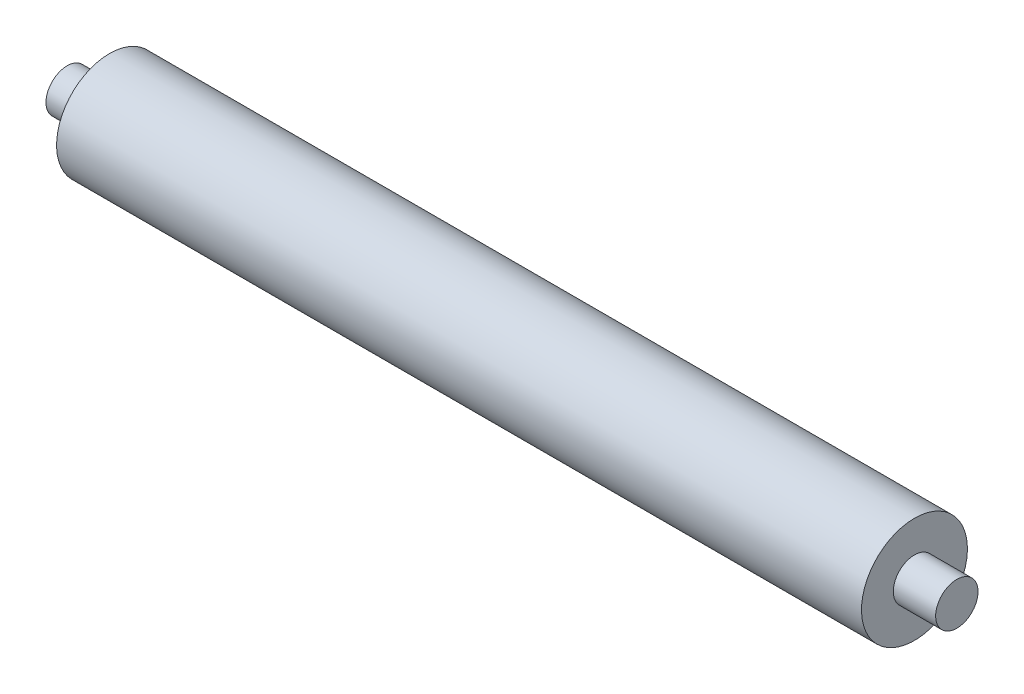
ISO-10303-21;
HEADER;
FILE_DESCRIPTION(('STEP AP214'),'2;1');
FILE_NAME('part.step','',(''),(''),'','','');
FILE_SCHEMA(('AUTOMOTIVE_DESIGN { 1 0 10303 214 1 1 1 1 }'));
ENDSEC;
DATA;
#1=APPLICATION_CONTEXT('core data for automotive mechanical design processes');
#2=APPLICATION_PROTOCOL_DEFINITION('international standard','automotive_design',2000,#1);
#3=PRODUCT_CONTEXT('',#1,'mechanical');
#4=PRODUCT('Part','Part','',(#3));
#5=PRODUCT_RELATED_PRODUCT_CATEGORY('part','',(#4));
#6=PRODUCT_DEFINITION_FORMATION('','',#4);
#7=PRODUCT_DEFINITION_CONTEXT('part definition',#1,'design');
#8=PRODUCT_DEFINITION('design','',#6,#7);
#9=PRODUCT_DEFINITION_SHAPE('','',#8);
#10=(LENGTH_UNIT() NAMED_UNIT(*) SI_UNIT(.MILLI.,.METRE.));
#11=(NAMED_UNIT(*) PLANE_ANGLE_UNIT() SI_UNIT($,.RADIAN.));
#12=(NAMED_UNIT(*) SI_UNIT($,.STERADIAN.) SOLID_ANGLE_UNIT());
#13=UNCERTAINTY_MEASURE_WITH_UNIT(LENGTH_MEASURE(1.E-05),#10,'distance_accuracy_value','');
#14=(GEOMETRIC_REPRESENTATION_CONTEXT(3) GLOBAL_UNCERTAINTY_ASSIGNED_CONTEXT((#13)) GLOBAL_UNIT_ASSIGNED_CONTEXT((#10,
#11,#12)) REPRESENTATION_CONTEXT('',''));
#15=CARTESIAN_POINT('',(0.,0.,0.));
#16=DIRECTION('',(0.,0.,1.));
#17=DIRECTION('',(1.,0.,0.));
#18=AXIS2_PLACEMENT_3D('',#15,#16,#17);
#19=CARTESIAN_POINT('',(0.,0.,0.));
#20=DIRECTION('',(-1.,0.,0.));
#21=DIRECTION('',(0.,-1.,0.));
#22=AXIS2_PLACEMENT_3D('',#19,#20,#21);
#23=PLANE('',#22);
#24=CARTESIAN_POINT('',(0.,0.,0.));
#25=DIRECTION('',(1.,0.,0.));
#26=DIRECTION('',(0.,1.,0.));
#27=AXIS2_PLACEMENT_3D('',#24,#25,#26);
#28=CIRCLE('',#27,5.);
#29=CARTESIAN_POINT('',(0.,5.,0.));
#30=VERTEX_POINT('',#29);
#31=EDGE_CURVE('E10',#30,#30,#28,.T.);
#32=ORIENTED_EDGE('',*,*,#31,.F.);
#33=EDGE_LOOP('',(#32));
#34=FACE_BOUND('',#33,.T.);
#35=ADVANCED_FACE('F43',(#34),#23,.T.);
#36=CARTESIAN_POINT('',(210.,0.,0.));
#37=DIRECTION('',(1.,0.,0.));
#38=DIRECTION('',(0.,1.,0.));
#39=AXIS2_PLACEMENT_3D('',#36,#37,#38);
#40=CYLINDRICAL_SURFACE('',#39,5.);
#41=ORIENTED_EDGE('',*,*,#31,.T.);
#42=EDGE_LOOP('',(#41));
#43=FACE_BOUND('',#42,.T.);
#44=CARTESIAN_POINT('',(10.,0.,0.));
#45=DIRECTION('',(1.,0.,0.));
#46=DIRECTION('',(0.,1.,0.));
#47=AXIS2_PLACEMENT_3D('',#44,#45,#46);
#48=CIRCLE('',#47,5.);
#49=CARTESIAN_POINT('',(10.,5.,0.));
#50=VERTEX_POINT('',#49);
#51=EDGE_CURVE('E50',#50,#50,#48,.T.);
#52=ORIENTED_EDGE('',*,*,#51,.F.);
#53=EDGE_LOOP('',(#52));
#54=FACE_BOUND('',#53,.T.);
#55=ADVANCED_FACE('F91',(#43,#54),#40,.T.);
#56=CARTESIAN_POINT('',(10.,5.,0.));
#57=DIRECTION('',(-1.,0.,0.));
#58=DIRECTION('',(0.,-1.,0.));
#59=AXIS2_PLACEMENT_3D('',#56,#57,#58);
#60=PLANE('',#59);
#61=ORIENTED_EDGE('',*,*,#51,.T.);
#62=EDGE_LOOP('',(#61));
#63=FACE_BOUND('',#62,.T.);
#64=CARTESIAN_POINT('',(10.,0.,0.));
#65=DIRECTION('',(1.,0.,0.));
#66=DIRECTION('',(0.,1.,0.));
#67=AXIS2_PLACEMENT_3D('',#64,#65,#66);
#68=CIRCLE('',#67,12.5);
#69=CARTESIAN_POINT('',(10.,12.5,0.));
#70=VERTEX_POINT('',#69);
#71=EDGE_CURVE('E55',#70,#70,#68,.T.);
#72=ORIENTED_EDGE('',*,*,#71,.F.);
#73=EDGE_LOOP('',(#72));
#74=FACE_BOUND('',#73,.T.);
#75=ADVANCED_FACE('F96',(#63,#74),#60,.T.);
#76=CARTESIAN_POINT('',(210.,0.,0.));
#77=DIRECTION('',(1.,0.,0.));
#78=DIRECTION('',(0.,1.,0.));
#79=AXIS2_PLACEMENT_3D('',#76,#77,#78);
#80=CYLINDRICAL_SURFACE('',#79,12.5);
#81=ORIENTED_EDGE('',*,*,#71,.T.);
#82=EDGE_LOOP('',(#81));
#83=FACE_BOUND('',#82,.T.);
#84=CARTESIAN_POINT('',(200.,0.,0.));
#85=DIRECTION('',(1.,0.,0.));
#86=DIRECTION('',(0.,1.,0.));
#87=AXIS2_PLACEMENT_3D('',#84,#85,#86);
#88=CIRCLE('',#87,12.5);
#89=CARTESIAN_POINT('',(200.,12.5,0.));
#90=VERTEX_POINT('',#89);
#91=EDGE_CURVE('E60',#90,#90,#88,.T.);
#92=ORIENTED_EDGE('',*,*,#91,.F.);
#93=EDGE_LOOP('',(#92));
#94=FACE_BOUND('',#93,.T.);
#95=ADVANCED_FACE('F87',(#83,#94),#80,.T.);
#96=CARTESIAN_POINT('',(200.,12.5,0.));
#97=DIRECTION('',(1.,0.,0.));
#98=DIRECTION('',(0.,1.,0.));
#99=AXIS2_PLACEMENT_3D('',#96,#97,#98);
#100=PLANE('',#99);
#101=ORIENTED_EDGE('',*,*,#91,.T.);
#102=EDGE_LOOP('',(#101));
#103=FACE_BOUND('',#102,.T.);
#104=CARTESIAN_POINT('',(200.,0.,0.));
#105=DIRECTION('',(1.,0.,0.));
#106=DIRECTION('',(0.,1.,0.));
#107=AXIS2_PLACEMENT_3D('',#104,#105,#106);
#108=CIRCLE('',#107,4.99999999999998);
#109=CARTESIAN_POINT('',(200.,5.,0.));
#110=VERTEX_POINT('',#109);
#111=EDGE_CURVE('E66',#110,#110,#108,.T.);
#112=ORIENTED_EDGE('',*,*,#111,.F.);
#113=EDGE_LOOP('',(#112));
#114=FACE_BOUND('',#113,.T.);
#115=ADVANCED_FACE('F79',(#103,#114),#100,.T.);
#116=CARTESIAN_POINT('',(210.,0.,0.));
#117=DIRECTION('',(1.,0.,0.));
#118=DIRECTION('',(0.,1.,0.));
#119=AXIS2_PLACEMENT_3D('',#116,#117,#118);
#120=CYLINDRICAL_SURFACE('',#119,4.99999999999998);
#121=ORIENTED_EDGE('',*,*,#111,.T.);
#122=EDGE_LOOP('',(#121));
#123=FACE_BOUND('',#122,.T.);
#124=CARTESIAN_POINT('',(210.,0.,0.));
#125=DIRECTION('',(1.,0.,0.));
#126=DIRECTION('',(0.,1.,0.));
#127=AXIS2_PLACEMENT_3D('',#124,#125,#126);
#128=CIRCLE('',#127,4.99999999999998);
#129=CARTESIAN_POINT('',(210.,5.,0.));
#130=VERTEX_POINT('',#129);
#131=EDGE_CURVE('E70',#130,#130,#128,.T.);
#132=ORIENTED_EDGE('',*,*,#131,.F.);
#133=EDGE_LOOP('',(#132));
#134=FACE_BOUND('',#133,.T.);
#135=ADVANCED_FACE('F77',(#123,#134),#120,.T.);
#136=CARTESIAN_POINT('',(210.,5.,0.));
#137=DIRECTION('',(1.,0.,0.));
#138=DIRECTION('',(0.,1.,0.));
#139=AXIS2_PLACEMENT_3D('',#136,#137,#138);
#140=PLANE('',#139);
#141=ORIENTED_EDGE('',*,*,#131,.T.);
#142=EDGE_LOOP('',(#141));
#143=FACE_BOUND('',#142,.T.);
#144=ADVANCED_FACE('F75',(#143),#140,.T.);
#145=CLOSED_SHELL('',(#35,#55,#75,#95,#115,#135,#144));
#146=MANIFOLD_SOLID_BREP('B2',#145);
#147=ADVANCED_BREP_SHAPE_REPRESENTATION('',(#18,#146),#14);
#148=SHAPE_DEFINITION_REPRESENTATION(#9,#147);
ENDSEC;
END-ISO-10303-21;
